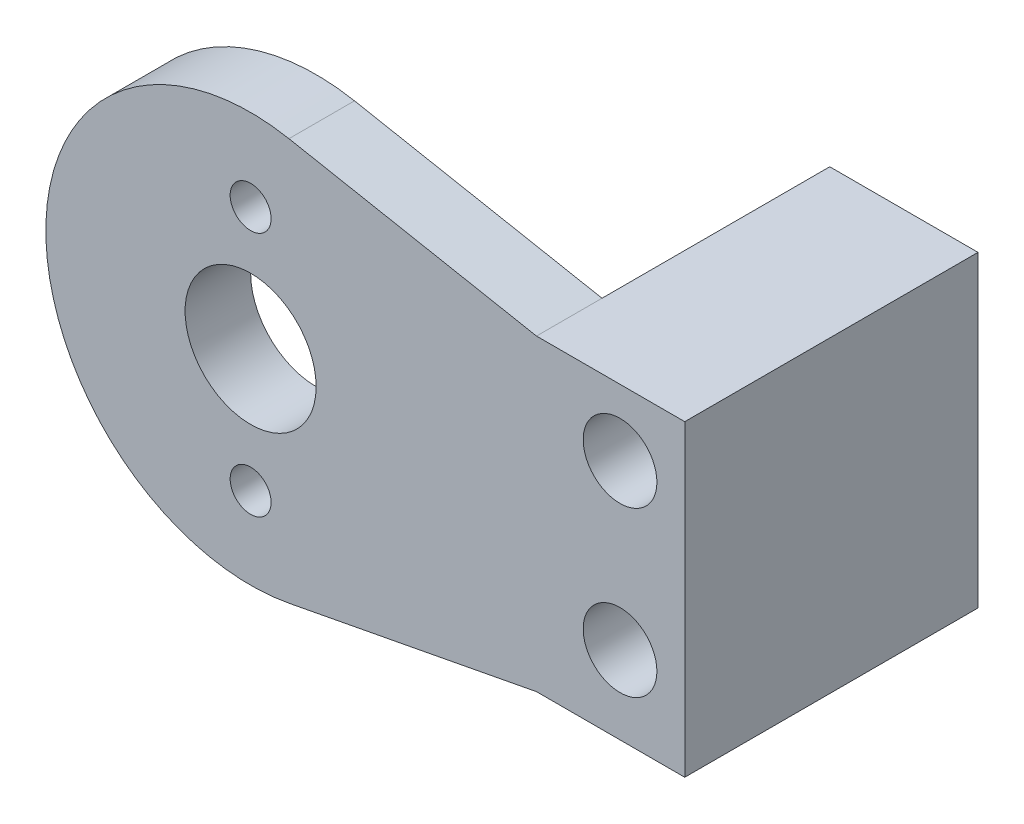
ISO-10303-21;
HEADER;
FILE_DESCRIPTION(('STEP AP214'),'2;1');
FILE_NAME('part.step','',(''),(''),'','','');
FILE_SCHEMA(('AUTOMOTIVE_DESIGN { 1 0 10303 214 1 1 1 1 }'));
ENDSEC;
DATA;
#1=APPLICATION_CONTEXT('core data for automotive mechanical design processes');
#2=APPLICATION_PROTOCOL_DEFINITION('international standard','automotive_design',2000,#1);
#3=PRODUCT_CONTEXT('',#1,'mechanical');
#4=PRODUCT('Part','Part','',(#3));
#5=PRODUCT_RELATED_PRODUCT_CATEGORY('part','',(#4));
#6=PRODUCT_DEFINITION_FORMATION('','',#4);
#7=PRODUCT_DEFINITION_CONTEXT('part definition',#1,'design');
#8=PRODUCT_DEFINITION('design','',#6,#7);
#9=PRODUCT_DEFINITION_SHAPE('','',#8);
#10=(LENGTH_UNIT() NAMED_UNIT(*) SI_UNIT(.MILLI.,.METRE.));
#11=(NAMED_UNIT(*) PLANE_ANGLE_UNIT() SI_UNIT($,.RADIAN.));
#12=(NAMED_UNIT(*) SI_UNIT($,.STERADIAN.) SOLID_ANGLE_UNIT());
#13=UNCERTAINTY_MEASURE_WITH_UNIT(LENGTH_MEASURE(1.E-05),#10,'distance_accuracy_value','');
#14=(GEOMETRIC_REPRESENTATION_CONTEXT(3) GLOBAL_UNCERTAINTY_ASSIGNED_CONTEXT((#13)) GLOBAL_UNIT_ASSIGNED_CONTEXT((#10,
#11,#12)) REPRESENTATION_CONTEXT('',''));
#15=CARTESIAN_POINT('',(0.,0.,0.));
#16=DIRECTION('',(0.,0.,1.));
#17=DIRECTION('',(1.,0.,0.));
#18=AXIS2_PLACEMENT_3D('',#15,#16,#17);
#19=CARTESIAN_POINT('',(0.,0.,83.9405432343483));
#20=DIRECTION('',(0.,-1.,0.));
#21=DIRECTION('',(1.,0.,0.));
#22=AXIS2_PLACEMENT_3D('',#19,#20,#21);
#23=PLANE('',#22);
#24=DIRECTION('',(0.,0.,-1.));
#25=VECTOR('',#24,1.);
#26=CARTESIAN_POINT('',(-9.05,0.,83.9405432343483));
#27=LINE('',#26,#25);
#28=CARTESIAN_POINT('',(-9.05,0.,83.9405432343483));
#29=VERTEX_POINT('',#28);
#30=CARTESIAN_POINT('',(-9.05,0.,79.9405425786972));
#31=VERTEX_POINT('',#30);
#32=EDGE_CURVE('E85',#29,#31,#27,.T.);
#33=ORIENTED_EDGE('',*,*,#32,.T.);
#34=DIRECTION('',(0.,0.,1.));
#35=VECTOR('',#34,1.);
#36=CARTESIAN_POINT('',(-9.05000000000001,0.,66.0405425786972));
#37=LINE('',#36,#35);
#38=CARTESIAN_POINT('',(-9.05000000000001,0.,66.0405425786972));
#39=VERTEX_POINT('',#38);
#40=EDGE_CURVE('E188',#39,#31,#37,.T.);
#41=ORIENTED_EDGE('',*,*,#40,.F.);
#42=DIRECTION('',(-1.,0.,0.));
#43=VECTOR('',#42,1.);
#44=CARTESIAN_POINT('',(-9.05000000000001,0.,66.0405425786972));
#45=LINE('',#44,#43);
#46=CARTESIAN_POINT('',(0.,0.,66.0405425786972));
#47=VERTEX_POINT('',#46);
#48=EDGE_CURVE('E186',#47,#39,#45,.T.);
#49=ORIENTED_EDGE('',*,*,#48,.F.);
#50=DIRECTION('',(0.,0.,-1.));
#51=VECTOR('',#50,1.);
#52=CARTESIAN_POINT('',(0.,0.,83.9405432343483));
#53=LINE('',#52,#51);
#54=CARTESIAN_POINT('',(0.,0.,83.9405432343483));
#55=VERTEX_POINT('',#54);
#56=EDGE_CURVE('E11',#55,#47,#53,.T.);
#57=ORIENTED_EDGE('',*,*,#56,.F.);
#58=DIRECTION('',(-1.,0.,0.));
#59=VECTOR('',#58,1.);
#60=CARTESIAN_POINT('',(0.,0.,83.9405432343483));
#61=LINE('',#60,#59);
#62=EDGE_CURVE('E143',#55,#29,#61,.T.);
#63=ORIENTED_EDGE('',*,*,#62,.T.);
#64=EDGE_LOOP('',(#33,#41,#49,#57,#63));
#65=FACE_BOUND('',#64,.T.);
#66=ADVANCED_FACE('F39',(#65),#23,.T.);
#67=CARTESIAN_POINT('',(0.,18.8,83.9405432343483));
#68=DIRECTION('',(1.,0.,0.));
#69=DIRECTION('',(0.,0.,-1.));
#70=AXIS2_PLACEMENT_3D('',#67,#68,#69);
#71=PLANE('',#70);
#72=ORIENTED_EDGE('',*,*,#56,.T.);
#73=DIRECTION('',(0.,-1.,0.));
#74=VECTOR('',#73,1.);
#75=CARTESIAN_POINT('',(0.,0.,66.0405425786972));
#76=LINE('',#75,#74);
#77=CARTESIAN_POINT('',(0.,18.8,66.0405425786972));
#78=VERTEX_POINT('',#77);
#79=EDGE_CURVE('E214',#78,#47,#76,.T.);
#80=ORIENTED_EDGE('',*,*,#79,.F.);
#81=DIRECTION('',(0.,0.,-1.));
#82=VECTOR('',#81,1.);
#83=CARTESIAN_POINT('',(0.,18.8,83.9405432343483));
#84=LINE('',#83,#82);
#85=CARTESIAN_POINT('',(0.,18.8,83.9405432343483));
#86=VERTEX_POINT('',#85);
#87=EDGE_CURVE('E49',#86,#78,#84,.T.);
#88=ORIENTED_EDGE('',*,*,#87,.F.);
#89=DIRECTION('',(0.,-1.,0.));
#90=VECTOR('',#89,1.);
#91=CARTESIAN_POINT('',(0.,18.8,83.9405432343483));
#92=LINE('',#91,#90);
#93=EDGE_CURVE('E118',#86,#55,#92,.T.);
#94=ORIENTED_EDGE('',*,*,#93,.T.);
#95=EDGE_LOOP('',(#72,#80,#88,#94));
#96=FACE_BOUND('',#95,.T.);
#97=ADVANCED_FACE('F213',(#96),#71,.T.);
#98=CARTESIAN_POINT('',(-9.05,18.8,83.9405432343483));
#99=DIRECTION('',(0.,1.,0.));
#100=DIRECTION('',(-1.,0.,0.));
#101=AXIS2_PLACEMENT_3D('',#98,#99,#100);
#102=PLANE('',#101);
#103=ORIENTED_EDGE('',*,*,#87,.T.);
#104=DIRECTION('',(1.,0.,0.));
#105=VECTOR('',#104,1.);
#106=CARTESIAN_POINT('',(0.,18.8,66.0405425786972));
#107=LINE('',#106,#105);
#108=CARTESIAN_POINT('',(-9.05,18.8,66.0405425786972));
#109=VERTEX_POINT('',#108);
#110=EDGE_CURVE('E182',#109,#78,#107,.T.);
#111=ORIENTED_EDGE('',*,*,#110,.F.);
#112=DIRECTION('',(0.,0.,1.));
#113=VECTOR('',#112,1.);
#114=CARTESIAN_POINT('',(-9.05,18.8,66.0405425786972));
#115=LINE('',#114,#113);
#116=CARTESIAN_POINT('',(-9.05,18.8,79.9405425786972));
#117=VERTEX_POINT('',#116);
#118=EDGE_CURVE('E106',#109,#117,#115,.T.);
#119=ORIENTED_EDGE('',*,*,#118,.T.);
#120=DIRECTION('',(0.,0.,-1.));
#121=VECTOR('',#120,1.);
#122=CARTESIAN_POINT('',(-9.05,18.8,83.9405432343483));
#123=LINE('',#122,#121);
#124=CARTESIAN_POINT('',(-9.05,18.8,83.9405432343483));
#125=VERTEX_POINT('',#124);
#126=EDGE_CURVE('E98',#125,#117,#123,.T.);
#127=ORIENTED_EDGE('',*,*,#126,.F.);
#128=DIRECTION('',(1.,0.,0.));
#129=VECTOR('',#128,1.);
#130=CARTESIAN_POINT('',(-9.05,18.8,83.9405432343483));
#131=LINE('',#130,#129);
#132=EDGE_CURVE('E102',#125,#86,#131,.T.);
#133=ORIENTED_EDGE('',*,*,#132,.T.);
#134=EDGE_LOOP('',(#103,#111,#119,#127,#133));
#135=FACE_BOUND('',#134,.T.);
#136=ADVANCED_FACE('F101',(#135),#102,.T.);
#137=CARTESIAN_POINT('',(-9.05,18.8,83.9405432343483));
#138=DIRECTION('',(0.187170296743463,0.982327481045381,0.));
#139=DIRECTION('',(-0.982327481045381,0.187170296743463,0.));
#140=AXIS2_PLACEMENT_3D('',#137,#138,#139);
#141=PLANE('',#140);
#142=DIRECTION('',(0.982327481045381,-0.187170296743463,0.));
#143=VECTOR('',#142,1.);
#144=CARTESIAN_POINT('',(-9.05,18.8,79.9405425786972));
#145=LINE('',#144,#143);
#146=CARTESIAN_POINT('',(-24.1603712907067,21.6790935130673,79.9405425786972));
#147=VERTEX_POINT('',#146);
#148=EDGE_CURVE('E140',#147,#117,#145,.T.);
#149=ORIENTED_EDGE('',*,*,#148,.F.);
#150=DIRECTION('',(0.,0.,-1.));
#151=VECTOR('',#150,1.);
#152=CARTESIAN_POINT('',(-24.1603712907067,21.6790935130673,83.9405432343483));
#153=LINE('',#152,#151);
#154=CARTESIAN_POINT('',(-24.1603712907067,21.6790935130673,83.9405432343483));
#155=VERTEX_POINT('',#154);
#156=EDGE_CURVE('E79',#155,#147,#153,.T.);
#157=ORIENTED_EDGE('',*,*,#156,.F.);
#158=DIRECTION('',(0.982327481045381,-0.187170296743463,0.));
#159=VECTOR('',#158,1.);
#160=CARTESIAN_POINT('',(-9.05,18.8,83.9405432343483));
#161=LINE('',#160,#159);
#162=EDGE_CURVE('E116',#155,#125,#161,.T.);
#163=ORIENTED_EDGE('',*,*,#162,.T.);
#164=ORIENTED_EDGE('',*,*,#126,.T.);
#165=EDGE_LOOP('',(#149,#157,#163,#164));
#166=FACE_BOUND('',#165,.T.);
#167=ADVANCED_FACE('F121',(#166),#141,.T.);
#168=CARTESIAN_POINT('',(-26.5,9.40000000000001,83.9405432343483));
#169=DIRECTION('',(0.,0.,-1.));
#170=DIRECTION('',(-1.,0.,0.));
#171=AXIS2_PLACEMENT_3D('',#168,#169,#170);
#172=CYLINDRICAL_SURFACE('',#171,12.5);
#173=CARTESIAN_POINT('',(-26.5,9.40000000000001,79.9405425786972));
#174=DIRECTION('',(0.,0.,-1.));
#175=DIRECTION('',(-1.,0.,0.));
#176=AXIS2_PLACEMENT_3D('',#173,#174,#175);
#177=CIRCLE('',#176,12.5);
#178=CARTESIAN_POINT('',(-24.1603712907067,-2.87909351306726,79.9405425786972));
#179=VERTEX_POINT('',#178);
#180=EDGE_CURVE('E136',#179,#147,#177,.T.);
#181=ORIENTED_EDGE('',*,*,#180,.F.);
#182=DIRECTION('',(0.,0.,-1.));
#183=VECTOR('',#182,1.);
#184=CARTESIAN_POINT('',(-24.1603712907067,-2.87909351306726,83.9405432343483));
#185=LINE('',#184,#183);
#186=CARTESIAN_POINT('',(-24.1603712907067,-2.87909351306726,83.9405432343483));
#187=VERTEX_POINT('',#186);
#188=EDGE_CURVE('E72',#187,#179,#185,.T.);
#189=ORIENTED_EDGE('',*,*,#188,.F.);
#190=CARTESIAN_POINT('',(-26.5,9.40000000000001,83.9405432343483));
#191=DIRECTION('',(0.,0.,-1.));
#192=DIRECTION('',(-1.,0.,0.));
#193=AXIS2_PLACEMENT_3D('',#190,#191,#192);
#194=CIRCLE('',#193,12.5);
#195=EDGE_CURVE('E123',#187,#155,#194,.T.);
#196=ORIENTED_EDGE('',*,*,#195,.T.);
#197=ORIENTED_EDGE('',*,*,#156,.T.);
#198=EDGE_LOOP('',(#181,#189,#196,#197));
#199=FACE_BOUND('',#198,.T.);
#200=ADVANCED_FACE('F279',(#199),#172,.T.);
#201=CARTESIAN_POINT('',(-9.05,0.,83.9405432343483));
#202=DIRECTION('',(0.187170296743462,-0.982327481045381,0.));
#203=DIRECTION('',(0.982327481045382,0.187170296743462,0.));
#204=AXIS2_PLACEMENT_3D('',#201,#202,#203);
#205=PLANE('',#204);
#206=DIRECTION('',(-0.982327481045382,-0.187170296743462,0.));
#207=VECTOR('',#206,1.);
#208=CARTESIAN_POINT('',(-9.05,0.,79.9405425786972));
#209=LINE('',#208,#207);
#210=EDGE_CURVE('E132',#31,#179,#209,.T.);
#211=ORIENTED_EDGE('',*,*,#210,.F.);
#212=ORIENTED_EDGE('',*,*,#32,.F.);
#213=DIRECTION('',(-0.982327481045382,-0.187170296743462,0.));
#214=VECTOR('',#213,1.);
#215=CARTESIAN_POINT('',(-9.05,0.,83.9405432343483));
#216=LINE('',#215,#214);
#217=EDGE_CURVE('E126',#29,#187,#216,.T.);
#218=ORIENTED_EDGE('',*,*,#217,.T.);
#219=ORIENTED_EDGE('',*,*,#188,.T.);
#220=EDGE_LOOP('',(#211,#212,#218,#219));
#221=FACE_BOUND('',#220,.T.);
#222=ADVANCED_FACE('F195',(#221),#205,.T.);
#223=CARTESIAN_POINT('',(-26.5,9.40000000000001,83.9405432343483));
#224=DIRECTION('',(0.,0.,-1.));
#225=DIRECTION('',(-1.,0.,0.));
#226=AXIS2_PLACEMENT_3D('',#223,#224,#225);
#227=PLANE('',#226);
#228=CARTESIAN_POINT('',(-26.5,1.9,83.9405432343483));
#229=DIRECTION('',(0.,0.,1.));
#230=DIRECTION('',(1.,0.,0.));
#231=AXIS2_PLACEMENT_3D('',#228,#229,#230);
#232=CIRCLE('',#231,1.25);
#233=CARTESIAN_POINT('',(-25.25,1.9,83.9405432343483));
#234=VERTEX_POINT('',#233);
#235=EDGE_CURVE('E224',#234,#234,#232,.T.);
#236=ORIENTED_EDGE('',*,*,#235,.F.);
#237=EDGE_LOOP('',(#236));
#238=FACE_BOUND('',#237,.T.);
#239=CARTESIAN_POINT('',(-26.5,16.9,83.9405432343483));
#240=DIRECTION('',(0.,0.,1.));
#241=DIRECTION('',(1.,0.,0.));
#242=AXIS2_PLACEMENT_3D('',#239,#240,#241);
#243=CIRCLE('',#242,1.25);
#244=CARTESIAN_POINT('',(-25.25,16.9,83.9405432343483));
#245=VERTEX_POINT('',#244);
#246=EDGE_CURVE('E228',#245,#245,#243,.T.);
#247=ORIENTED_EDGE('',*,*,#246,.F.);
#248=EDGE_LOOP('',(#247));
#249=FACE_BOUND('',#248,.T.);
#250=CARTESIAN_POINT('',(-3.95,4.75,83.9405432343483));
#251=DIRECTION('',(0.,0.,1.));
#252=DIRECTION('',(1.,0.,0.));
#253=AXIS2_PLACEMENT_3D('',#250,#251,#252);
#254=CIRCLE('',#253,2.25);
#255=CARTESIAN_POINT('',(-1.7,4.75,83.9405432343483));
#256=VERTEX_POINT('',#255);
#257=EDGE_CURVE('E232',#256,#256,#254,.T.);
#258=ORIENTED_EDGE('',*,*,#257,.F.);
#259=EDGE_LOOP('',(#258));
#260=FACE_BOUND('',#259,.T.);
#261=CARTESIAN_POINT('',(-3.95,14.75,83.9405432343483));
#262=DIRECTION('',(0.,0.,1.));
#263=DIRECTION('',(1.,0.,0.));
#264=AXIS2_PLACEMENT_3D('',#261,#262,#263);
#265=CIRCLE('',#264,2.25);
#266=CARTESIAN_POINT('',(-1.7,14.75,83.9405432343483));
#267=VERTEX_POINT('',#266);
#268=EDGE_CURVE('E223',#267,#267,#265,.T.);
#269=ORIENTED_EDGE('',*,*,#268,.F.);
#270=EDGE_LOOP('',(#269));
#271=FACE_BOUND('',#270,.T.);
#272=CARTESIAN_POINT('',(-26.5,9.40000000000001,83.9405432343483));
#273=DIRECTION('',(0.,0.,1.));
#274=DIRECTION('',(1.,0.,0.));
#275=AXIS2_PLACEMENT_3D('',#272,#273,#274);
#276=CIRCLE('',#275,4.);
#277=CARTESIAN_POINT('',(-22.5,9.40000000000001,83.9405432343483));
#278=VERTEX_POINT('',#277);
#279=EDGE_CURVE('E158',#278,#278,#276,.T.);
#280=ORIENTED_EDGE('',*,*,#279,.F.);
#281=EDGE_LOOP('',(#280));
#282=FACE_BOUND('',#281,.T.);
#283=ORIENTED_EDGE('',*,*,#62,.F.);
#284=ORIENTED_EDGE('',*,*,#93,.F.);
#285=ORIENTED_EDGE('',*,*,#132,.F.);
#286=ORIENTED_EDGE('',*,*,#162,.F.);
#287=ORIENTED_EDGE('',*,*,#195,.F.);
#288=ORIENTED_EDGE('',*,*,#217,.F.);
#289=EDGE_LOOP('',(#283,#284,#285,#286,#287,#288));
#290=FACE_BOUND('',#289,.T.);
#291=ADVANCED_FACE('F114',(#238,#249,#260,#271,#282,#290),#227,.F.);
#292=CARTESIAN_POINT('',(-26.5,9.40000000000001,79.9405425786972));
#293=DIRECTION('',(0.,0.,-1.));
#294=DIRECTION('',(-1.,0.,0.));
#295=AXIS2_PLACEMENT_3D('',#292,#293,#294);
#296=PLANE('',#295);
#297=CARTESIAN_POINT('',(-26.5,1.9,79.9405425786972));
#298=DIRECTION('',(0.,0.,-1.));
#299=DIRECTION('',(-1.,0.,0.));
#300=AXIS2_PLACEMENT_3D('',#297,#298,#299);
#301=CIRCLE('',#300,1.25);
#302=CARTESIAN_POINT('',(-27.75,1.9,79.9405425786972));
#303=VERTEX_POINT('',#302);
#304=EDGE_CURVE('E42',#303,#303,#301,.T.);
#305=ORIENTED_EDGE('',*,*,#304,.F.);
#306=EDGE_LOOP('',(#305));
#307=FACE_BOUND('',#306,.T.);
#308=CARTESIAN_POINT('',(-26.5,16.9,79.9405425786972));
#309=DIRECTION('',(0.,0.,-1.));
#310=DIRECTION('',(-1.,0.,0.));
#311=AXIS2_PLACEMENT_3D('',#308,#309,#310);
#312=CIRCLE('',#311,1.25);
#313=CARTESIAN_POINT('',(-27.75,16.9,79.9405425786972));
#314=VERTEX_POINT('',#313);
#315=EDGE_CURVE('E165',#314,#314,#312,.T.);
#316=ORIENTED_EDGE('',*,*,#315,.F.);
#317=EDGE_LOOP('',(#316));
#318=FACE_BOUND('',#317,.T.);
#319=CARTESIAN_POINT('',(-26.5,9.40000000000001,79.9405425786972));
#320=DIRECTION('',(0.,0.,-1.));
#321=DIRECTION('',(-1.,0.,0.));
#322=AXIS2_PLACEMENT_3D('',#319,#320,#321);
#323=CIRCLE('',#322,4.);
#324=CARTESIAN_POINT('',(-30.5,9.40000000000001,79.9405425786972));
#325=VERTEX_POINT('',#324);
#326=EDGE_CURVE('E162',#325,#325,#323,.T.);
#327=ORIENTED_EDGE('',*,*,#326,.F.);
#328=EDGE_LOOP('',(#327));
#329=FACE_BOUND('',#328,.T.);
#330=DIRECTION('',(0.,1.,0.));
#331=VECTOR('',#330,1.);
#332=CARTESIAN_POINT('',(-9.05,18.8,79.9405425786972));
#333=LINE('',#332,#331);
#334=EDGE_CURVE('E172',#31,#117,#333,.T.);
#335=ORIENTED_EDGE('',*,*,#334,.F.);
#336=ORIENTED_EDGE('',*,*,#210,.T.);
#337=ORIENTED_EDGE('',*,*,#180,.T.);
#338=ORIENTED_EDGE('',*,*,#148,.T.);
#339=EDGE_LOOP('',(#335,#336,#337,#338));
#340=FACE_BOUND('',#339,.T.);
#341=ADVANCED_FACE('F245',(#307,#318,#329,#340),#296,.T.);
#342=CARTESIAN_POINT('',(-9.05,18.8,66.0405425786972));
#343=DIRECTION('',(1.,0.,0.));
#344=DIRECTION('',(0.,1.,0.));
#345=AXIS2_PLACEMENT_3D('',#342,#343,#344);
#346=PLANE('',#345);
#347=ORIENTED_EDGE('',*,*,#334,.T.);
#348=ORIENTED_EDGE('',*,*,#118,.F.);
#349=DIRECTION('',(0.,1.,0.));
#350=VECTOR('',#349,1.);
#351=CARTESIAN_POINT('',(-9.05,18.8,66.0405425786972));
#352=LINE('',#351,#350);
#353=EDGE_CURVE('E176',#39,#109,#352,.T.);
#354=ORIENTED_EDGE('',*,*,#353,.F.);
#355=ORIENTED_EDGE('',*,*,#40,.T.);
#356=EDGE_LOOP('',(#347,#348,#354,#355));
#357=FACE_BOUND('',#356,.T.);
#358=ADVANCED_FACE('F199',(#357),#346,.F.);
#359=CARTESIAN_POINT('',(0.,0.,66.0405425786972));
#360=DIRECTION('',(0.,0.,1.));
#361=DIRECTION('',(1.,0.,0.));
#362=AXIS2_PLACEMENT_3D('',#359,#360,#361);
#363=PLANE('',#362);
#364=CARTESIAN_POINT('',(-3.95,4.75,66.0405425786972));
#365=DIRECTION('',(0.,0.,1.));
#366=DIRECTION('',(1.,0.,0.));
#367=AXIS2_PLACEMENT_3D('',#364,#365,#366);
#368=CIRCLE('',#367,2.25);
#369=CARTESIAN_POINT('',(-1.7,4.75,66.0405425786972));
#370=VERTEX_POINT('',#369);
#371=EDGE_CURVE('E157',#370,#370,#368,.T.);
#372=ORIENTED_EDGE('',*,*,#371,.T.);
#373=EDGE_LOOP('',(#372));
#374=FACE_BOUND('',#373,.T.);
#375=CARTESIAN_POINT('',(-3.95,14.75,66.0405425786972));
#376=DIRECTION('',(0.,0.,1.));
#377=DIRECTION('',(1.,0.,0.));
#378=AXIS2_PLACEMENT_3D('',#375,#376,#377);
#379=CIRCLE('',#378,2.25);
#380=CARTESIAN_POINT('',(-1.7,14.75,66.0405425786972));
#381=VERTEX_POINT('',#380);
#382=EDGE_CURVE('E153',#381,#381,#379,.T.);
#383=ORIENTED_EDGE('',*,*,#382,.T.);
#384=EDGE_LOOP('',(#383));
#385=FACE_BOUND('',#384,.T.);
#386=ORIENTED_EDGE('',*,*,#353,.T.);
#387=ORIENTED_EDGE('',*,*,#110,.T.);
#388=ORIENTED_EDGE('',*,*,#79,.T.);
#389=ORIENTED_EDGE('',*,*,#48,.T.);
#390=EDGE_LOOP('',(#386,#387,#388,#389));
#391=FACE_BOUND('',#390,.T.);
#392=ADVANCED_FACE('F205',(#374,#385,#391),#363,.F.);
#393=CARTESIAN_POINT('',(-3.95,14.75,53.9405432343483));
#394=DIRECTION('',(0.,0.,1.));
#395=DIRECTION('',(1.,0.,0.));
#396=AXIS2_PLACEMENT_3D('',#393,#394,#395);
#397=CYLINDRICAL_SURFACE('',#396,2.25);
#398=ORIENTED_EDGE('',*,*,#268,.T.);
#399=EDGE_LOOP('',(#398));
#400=FACE_BOUND('',#399,.T.);
#401=ORIENTED_EDGE('',*,*,#382,.F.);
#402=EDGE_LOOP('',(#401));
#403=FACE_BOUND('',#402,.T.);
#404=ADVANCED_FACE('F240',(#400,#403),#397,.F.);
#405=CARTESIAN_POINT('',(-3.95,4.75,53.9405432343483));
#406=DIRECTION('',(0.,0.,1.));
#407=DIRECTION('',(1.,0.,0.));
#408=AXIS2_PLACEMENT_3D('',#405,#406,#407);
#409=CYLINDRICAL_SURFACE('',#408,2.25);
#410=ORIENTED_EDGE('',*,*,#257,.T.);
#411=EDGE_LOOP('',(#410));
#412=FACE_BOUND('',#411,.T.);
#413=ORIENTED_EDGE('',*,*,#371,.F.);
#414=EDGE_LOOP('',(#413));
#415=FACE_BOUND('',#414,.T.);
#416=ADVANCED_FACE('F253',(#412,#415),#409,.F.);
#417=CARTESIAN_POINT('',(-26.5,9.40000000000001,53.9405432343483));
#418=DIRECTION('',(0.,0.,1.));
#419=DIRECTION('',(1.,0.,0.));
#420=AXIS2_PLACEMENT_3D('',#417,#418,#419);
#421=CYLINDRICAL_SURFACE('',#420,4.);
#422=ORIENTED_EDGE('',*,*,#326,.T.);
#423=EDGE_LOOP('',(#422));
#424=FACE_BOUND('',#423,.T.);
#425=ORIENTED_EDGE('',*,*,#279,.T.);
#426=EDGE_LOOP('',(#425));
#427=FACE_BOUND('',#426,.T.);
#428=ADVANCED_FACE('F250',(#424,#427),#421,.F.);
#429=CARTESIAN_POINT('',(-26.5,16.9,53.9405432343483));
#430=DIRECTION('',(0.,0.,1.));
#431=DIRECTION('',(1.,0.,0.));
#432=AXIS2_PLACEMENT_3D('',#429,#430,#431);
#433=CYLINDRICAL_SURFACE('',#432,1.25);
#434=ORIENTED_EDGE('',*,*,#315,.T.);
#435=EDGE_LOOP('',(#434));
#436=FACE_BOUND('',#435,.T.);
#437=ORIENTED_EDGE('',*,*,#246,.T.);
#438=EDGE_LOOP('',(#437));
#439=FACE_BOUND('',#438,.T.);
#440=ADVANCED_FACE('F252',(#436,#439),#433,.F.);
#441=CARTESIAN_POINT('',(-26.5,1.9,53.9405432343483));
#442=DIRECTION('',(0.,0.,1.));
#443=DIRECTION('',(1.,0.,0.));
#444=AXIS2_PLACEMENT_3D('',#441,#442,#443);
#445=CYLINDRICAL_SURFACE('',#444,1.25);
#446=ORIENTED_EDGE('',*,*,#304,.T.);
#447=EDGE_LOOP('',(#446));
#448=FACE_BOUND('',#447,.T.);
#449=ORIENTED_EDGE('',*,*,#235,.T.);
#450=EDGE_LOOP('',(#449));
#451=FACE_BOUND('',#450,.T.);
#452=ADVANCED_FACE('F260',(#448,#451),#445,.F.);
#453=CLOSED_SHELL('',(#66,#97,#136,#167,#200,#222,#291,#341,#358,#392,#404,#416,#428,#440,#452));
#454=MANIFOLD_SOLID_BREP('B2',#453);
#455=ADVANCED_BREP_SHAPE_REPRESENTATION('',(#18,#454),#14);
#456=SHAPE_DEFINITION_REPRESENTATION(#9,#455);
ENDSEC;
END-ISO-10303-21;
